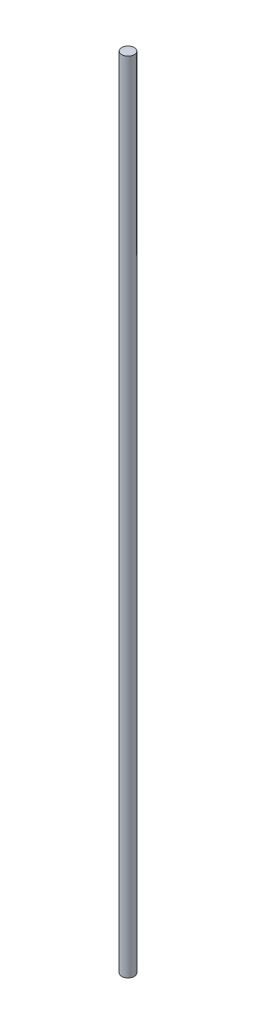
ISO-10303-21;
HEADER;
FILE_DESCRIPTION(('STEP AP214'),'2;1');
FILE_NAME('part.step','',(''),(''),'','','');
FILE_SCHEMA(('AUTOMOTIVE_DESIGN { 1 0 10303 214 1 1 1 1 }'));
ENDSEC;
DATA;
#1=APPLICATION_CONTEXT('core data for automotive mechanical design processes');
#2=APPLICATION_PROTOCOL_DEFINITION('international standard','automotive_design',2000,#1);
#3=PRODUCT_CONTEXT('',#1,'mechanical');
#4=PRODUCT('Part','Part','',(#3));
#5=PRODUCT_RELATED_PRODUCT_CATEGORY('part','',(#4));
#6=PRODUCT_DEFINITION_FORMATION('','',#4);
#7=PRODUCT_DEFINITION_CONTEXT('part definition',#1,'design');
#8=PRODUCT_DEFINITION('design','',#6,#7);
#9=PRODUCT_DEFINITION_SHAPE('','',#8);
#10=(LENGTH_UNIT() NAMED_UNIT(*) SI_UNIT(.MILLI.,.METRE.));
#11=(NAMED_UNIT(*) PLANE_ANGLE_UNIT() SI_UNIT($,.RADIAN.));
#12=(NAMED_UNIT(*) SI_UNIT($,.STERADIAN.) SOLID_ANGLE_UNIT());
#13=UNCERTAINTY_MEASURE_WITH_UNIT(LENGTH_MEASURE(1.E-05),#10,'distance_accuracy_value','');
#14=(GEOMETRIC_REPRESENTATION_CONTEXT(3) GLOBAL_UNCERTAINTY_ASSIGNED_CONTEXT((#13)) GLOBAL_UNIT_ASSIGNED_CONTEXT((#10,
#11,#12)) REPRESENTATION_CONTEXT('',''));
#15=CARTESIAN_POINT('',(0.,0.,0.));
#16=DIRECTION('',(0.,0.,1.));
#17=DIRECTION('',(1.,0.,0.));
#18=AXIS2_PLACEMENT_3D('',#15,#16,#17);
#19=CARTESIAN_POINT('',(0.,254.,0.));
#20=DIRECTION('',(0.,-1.,0.));
#21=DIRECTION('',(0.,0.,-1.));
#22=AXIS2_PLACEMENT_3D('',#19,#20,#21);
#23=CYLINDRICAL_SURFACE('',#22,1.984375);
#24=CARTESIAN_POINT('',(0.,254.,0.));
#25=DIRECTION('',(0.,1.,0.));
#26=DIRECTION('',(0.,0.,1.));
#27=AXIS2_PLACEMENT_3D('',#24,#25,#26);
#28=CIRCLE('',#27,1.984375);
#29=CARTESIAN_POINT('',(0.,254.,1.984375));
#30=VERTEX_POINT('',#29);
#31=EDGE_CURVE('E10',#30,#30,#28,.T.);
#32=ORIENTED_EDGE('',*,*,#31,.F.);
#33=EDGE_LOOP('',(#32));
#34=FACE_BOUND('',#33,.T.);
#35=CARTESIAN_POINT('',(0.,0.,0.));
#36=DIRECTION('',(0.,1.,0.));
#37=DIRECTION('',(0.,0.,1.));
#38=AXIS2_PLACEMENT_3D('',#35,#36,#37);
#39=CIRCLE('',#38,1.984375);
#40=CARTESIAN_POINT('',(0.,0.,1.984375));
#41=VERTEX_POINT('',#40);
#42=EDGE_CURVE('E37',#41,#41,#39,.T.);
#43=ORIENTED_EDGE('',*,*,#42,.T.);
#44=EDGE_LOOP('',(#43));
#45=FACE_BOUND('',#44,.T.);
#46=ADVANCED_FACE('F34',(#34,#45),#23,.T.);
#47=CARTESIAN_POINT('',(0.,254.,0.));
#48=DIRECTION('',(0.,1.,0.));
#49=DIRECTION('',(0.,0.,1.));
#50=AXIS2_PLACEMENT_3D('',#47,#48,#49);
#51=PLANE('',#50);
#52=ORIENTED_EDGE('',*,*,#31,.T.);
#53=EDGE_LOOP('',(#52));
#54=FACE_BOUND('',#53,.T.);
#55=ADVANCED_FACE('F49',(#54),#51,.T.);
#56=CARTESIAN_POINT('',(0.,0.,0.));
#57=DIRECTION('',(0.,1.,0.));
#58=DIRECTION('',(0.,0.,1.));
#59=AXIS2_PLACEMENT_3D('',#56,#57,#58);
#60=PLANE('',#59);
#61=ORIENTED_EDGE('',*,*,#42,.F.);
#62=EDGE_LOOP('',(#61));
#63=FACE_BOUND('',#62,.T.);
#64=ADVANCED_FACE('F47',(#63),#60,.F.);
#65=CLOSED_SHELL('',(#46,#55,#64));
#66=MANIFOLD_SOLID_BREP('B2',#65);
#67=ADVANCED_BREP_SHAPE_REPRESENTATION('',(#18,#66),#14);
#68=SHAPE_DEFINITION_REPRESENTATION(#9,#67);
ENDSEC;
END-ISO-10303-21;
